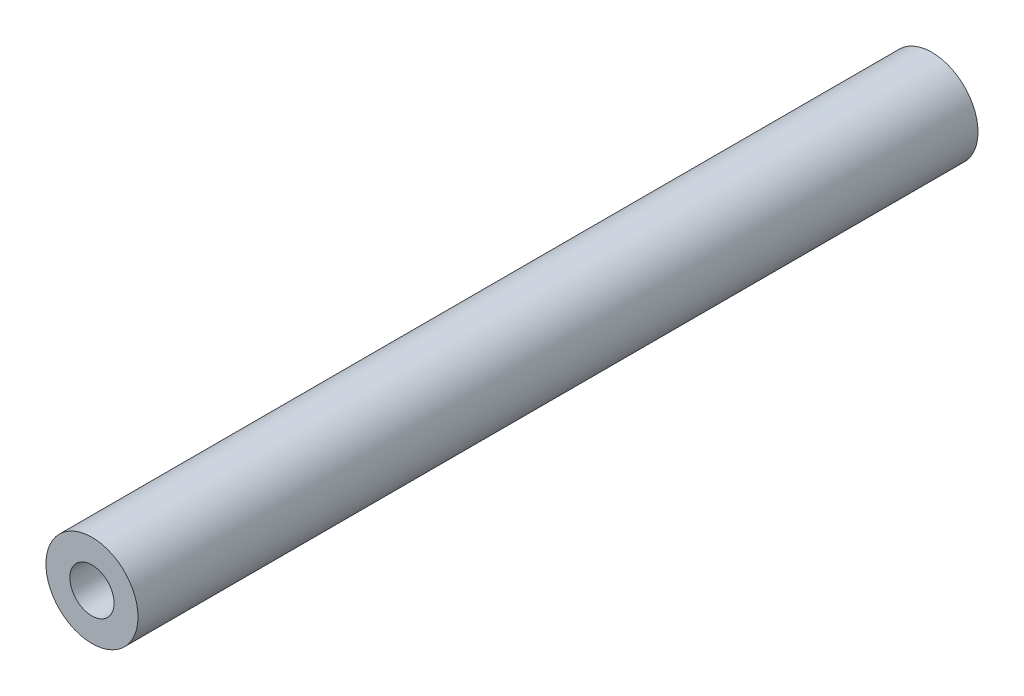
ISO-10303-21;
HEADER;
FILE_DESCRIPTION(('STEP AP214'),'2;1');
FILE_NAME('part.step','',(''),(''),'','','');
FILE_SCHEMA(('AUTOMOTIVE_DESIGN { 1 0 10303 214 1 1 1 1 }'));
ENDSEC;
DATA;
#1=APPLICATION_CONTEXT('core data for automotive mechanical design processes');
#2=APPLICATION_PROTOCOL_DEFINITION('international standard','automotive_design',2000,#1);
#3=PRODUCT_CONTEXT('',#1,'mechanical');
#4=PRODUCT('Part','Part','',(#3));
#5=PRODUCT_RELATED_PRODUCT_CATEGORY('part','',(#4));
#6=PRODUCT_DEFINITION_FORMATION('','',#4);
#7=PRODUCT_DEFINITION_CONTEXT('part definition',#1,'design');
#8=PRODUCT_DEFINITION('design','',#6,#7);
#9=PRODUCT_DEFINITION_SHAPE('','',#8);
#10=(LENGTH_UNIT() NAMED_UNIT(*) SI_UNIT(.MILLI.,.METRE.));
#11=(NAMED_UNIT(*) PLANE_ANGLE_UNIT() SI_UNIT($,.RADIAN.));
#12=(NAMED_UNIT(*) SI_UNIT($,.STERADIAN.) SOLID_ANGLE_UNIT());
#13=UNCERTAINTY_MEASURE_WITH_UNIT(LENGTH_MEASURE(1.E-05),#10,'distance_accuracy_value','');
#14=(GEOMETRIC_REPRESENTATION_CONTEXT(3) GLOBAL_UNCERTAINTY_ASSIGNED_CONTEXT((#13)) GLOBAL_UNIT_ASSIGNED_CONTEXT((#10,
#11,#12)) REPRESENTATION_CONTEXT('',''));
#15=CARTESIAN_POINT('',(0.,0.,0.));
#16=DIRECTION('',(0.,0.,1.));
#17=DIRECTION('',(1.,0.,0.));
#18=AXIS2_PLACEMENT_3D('',#15,#16,#17);
#19=CARTESIAN_POINT('',(0.,0.,57.912));
#20=DIRECTION('',(0.,0.,1.));
#21=DIRECTION('',(1.,0.,0.));
#22=AXIS2_PLACEMENT_3D('',#19,#20,#21);
#23=PLANE('',#22);
#24=CARTESIAN_POINT('',(0.,0.,57.912));
#25=DIRECTION('',(0.,0.,1.));
#26=DIRECTION('',(1.,0.,0.));
#27=AXIS2_PLACEMENT_3D('',#24,#25,#26);
#28=CIRCLE('',#27,3.175);
#29=CARTESIAN_POINT('',(3.175,0.,57.912));
#30=VERTEX_POINT('',#29);
#31=EDGE_CURVE('E10',#30,#30,#28,.T.);
#32=ORIENTED_EDGE('',*,*,#31,.T.);
#33=EDGE_LOOP('',(#32));
#34=FACE_BOUND('',#33,.T.);
#35=CARTESIAN_POINT('',(0.,0.,57.912));
#36=DIRECTION('',(0.,0.,1.));
#37=DIRECTION('',(1.,0.,0.));
#38=AXIS2_PLACEMENT_3D('',#35,#36,#37);
#39=CIRCLE('',#38,1.524);
#40=CARTESIAN_POINT('',(1.524,0.,57.912));
#41=VERTEX_POINT('',#40);
#42=EDGE_CURVE('E41',#41,#41,#39,.T.);
#43=ORIENTED_EDGE('',*,*,#42,.F.);
#44=EDGE_LOOP('',(#43));
#45=FACE_BOUND('',#44,.T.);
#46=ADVANCED_FACE('F30',(#34,#45),#23,.T.);
#47=CARTESIAN_POINT('',(0.,0.,0.));
#48=DIRECTION('',(0.,0.,1.));
#49=DIRECTION('',(1.,0.,0.));
#50=AXIS2_PLACEMENT_3D('',#47,#48,#49);
#51=PLANE('',#50);
#52=CARTESIAN_POINT('',(0.,0.,0.));
#53=DIRECTION('',(0.,0.,1.));
#54=DIRECTION('',(1.,0.,0.));
#55=AXIS2_PLACEMENT_3D('',#52,#53,#54);
#56=CIRCLE('',#55,3.175);
#57=CARTESIAN_POINT('',(3.175,0.,0.));
#58=VERTEX_POINT('',#57);
#59=EDGE_CURVE('E34',#58,#58,#56,.T.);
#60=ORIENTED_EDGE('',*,*,#59,.F.);
#61=EDGE_LOOP('',(#60));
#62=FACE_BOUND('',#61,.T.);
#63=CARTESIAN_POINT('',(0.,0.,0.));
#64=DIRECTION('',(0.,0.,1.));
#65=DIRECTION('',(1.,0.,0.));
#66=AXIS2_PLACEMENT_3D('',#63,#64,#65);
#67=CIRCLE('',#66,1.524);
#68=CARTESIAN_POINT('',(1.524,0.,0.));
#69=VERTEX_POINT('',#68);
#70=EDGE_CURVE('E43',#69,#69,#67,.T.);
#71=ORIENTED_EDGE('',*,*,#70,.T.);
#72=EDGE_LOOP('',(#71));
#73=FACE_BOUND('',#72,.T.);
#74=ADVANCED_FACE('F53',(#62,#73),#51,.F.);
#75=CARTESIAN_POINT('',(0.,0.,57.912));
#76=DIRECTION('',(0.,0.,-1.));
#77=DIRECTION('',(-1.,0.,0.));
#78=AXIS2_PLACEMENT_3D('',#75,#76,#77);
#79=CYLINDRICAL_SURFACE('',#78,3.175);
#80=ORIENTED_EDGE('',*,*,#31,.F.);
#81=EDGE_LOOP('',(#80));
#82=FACE_BOUND('',#81,.T.);
#83=ORIENTED_EDGE('',*,*,#59,.T.);
#84=EDGE_LOOP('',(#83));
#85=FACE_BOUND('',#84,.T.);
#86=ADVANCED_FACE('F32',(#82,#85),#79,.T.);
#87=CARTESIAN_POINT('',(0.,0.,57.912));
#88=DIRECTION('',(0.,0.,-1.));
#89=DIRECTION('',(-1.,0.,0.));
#90=AXIS2_PLACEMENT_3D('',#87,#88,#89);
#91=CYLINDRICAL_SURFACE('',#90,1.524);
#92=ORIENTED_EDGE('',*,*,#42,.T.);
#93=EDGE_LOOP('',(#92));
#94=FACE_BOUND('',#93,.T.);
#95=ORIENTED_EDGE('',*,*,#70,.F.);
#96=EDGE_LOOP('',(#95));
#97=FACE_BOUND('',#96,.T.);
#98=ADVANCED_FACE('F49',(#94,#97),#91,.F.);
#99=CLOSED_SHELL('',(#46,#74,#86,#98));
#100=MANIFOLD_SOLID_BREP('B2',#99);
#101=ADVANCED_BREP_SHAPE_REPRESENTATION('',(#18,#100),#14);
#102=SHAPE_DEFINITION_REPRESENTATION(#9,#101);
ENDSEC;
END-ISO-10303-21;
